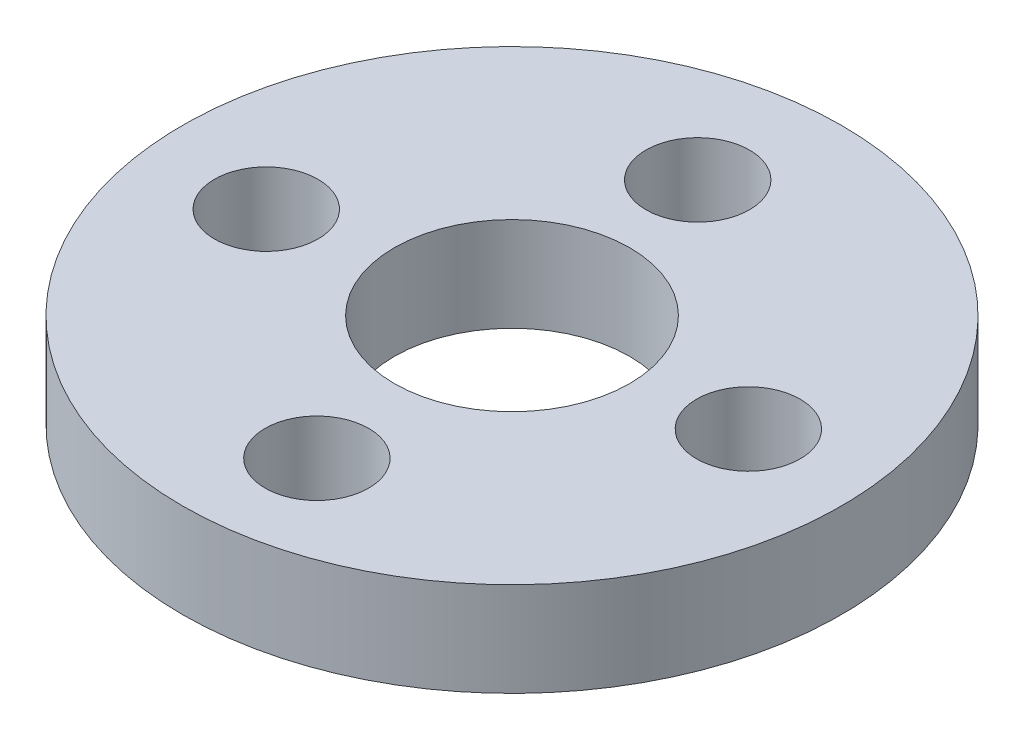
ISO-10303-21;
HEADER;
FILE_DESCRIPTION(('STEP AP214'),'2;1');
FILE_NAME('part.step','',(''),(''),'','','');
FILE_SCHEMA(('AUTOMOTIVE_DESIGN { 1 0 10303 214 1 1 1 1 }'));
ENDSEC;
DATA;
#1=APPLICATION_CONTEXT('core data for automotive mechanical design processes');
#2=APPLICATION_PROTOCOL_DEFINITION('international standard','automotive_design',2000,#1);
#3=PRODUCT_CONTEXT('',#1,'mechanical');
#4=PRODUCT('Part','Part','',(#3));
#5=PRODUCT_RELATED_PRODUCT_CATEGORY('part','',(#4));
#6=PRODUCT_DEFINITION_FORMATION('','',#4);
#7=PRODUCT_DEFINITION_CONTEXT('part definition',#1,'design');
#8=PRODUCT_DEFINITION('design','',#6,#7);
#9=PRODUCT_DEFINITION_SHAPE('','',#8);
#10=(LENGTH_UNIT() NAMED_UNIT(*) SI_UNIT(.MILLI.,.METRE.));
#11=(NAMED_UNIT(*) PLANE_ANGLE_UNIT() SI_UNIT($,.RADIAN.));
#12=(NAMED_UNIT(*) SI_UNIT($,.STERADIAN.) SOLID_ANGLE_UNIT());
#13=UNCERTAINTY_MEASURE_WITH_UNIT(LENGTH_MEASURE(1.E-05),#10,'distance_accuracy_value','');
#14=(GEOMETRIC_REPRESENTATION_CONTEXT(3) GLOBAL_UNCERTAINTY_ASSIGNED_CONTEXT((#13)) GLOBAL_UNIT_ASSIGNED_CONTEXT((#10,
#11,#12)) REPRESENTATION_CONTEXT('',''));
#15=CARTESIAN_POINT('',(0.,0.,0.));
#16=DIRECTION('',(0.,0.,1.));
#17=DIRECTION('',(1.,0.,0.));
#18=AXIS2_PLACEMENT_3D('',#15,#16,#17);
#19=CARTESIAN_POINT('',(0.,2.,0.));
#20=DIRECTION('',(0.,1.,0.));
#21=DIRECTION('',(0.,0.,1.));
#22=AXIS2_PLACEMENT_3D('',#19,#20,#21);
#23=PLANE('',#22);
#24=CARTESIAN_POINT('',(0.,2.,0.));
#25=DIRECTION('',(0.,1.,0.));
#26=DIRECTION('',(0.,0.,1.));
#27=AXIS2_PLACEMENT_3D('',#24,#25,#26);
#28=CIRCLE('',#27,2.5);
#29=CARTESIAN_POINT('',(0.,2.,2.5));
#30=VERTEX_POINT('',#29);
#31=EDGE_CURVE('E69',#30,#30,#28,.T.);
#32=ORIENTED_EDGE('',*,*,#31,.F.);
#33=EDGE_LOOP('',(#32));
#34=FACE_BOUND('',#33,.T.);
#35=CARTESIAN_POINT('',(0.551250558269466,2.,4.69562518740092));
#36=DIRECTION('',(0.,-1.,0.));
#37=DIRECTION('',(-0.231601331690098,0.,-0.972810784869994));
#38=AXIS2_PLACEMENT_3D('',#35,#36,#37);
#39=CIRCLE('',#38,1.1);
#40=CARTESIAN_POINT('',(0.296489093410358,2.,3.62553332404393));
#41=VERTEX_POINT('',#40);
#42=EDGE_CURVE('E51',#41,#41,#39,.T.);
#43=ORIENTED_EDGE('',*,*,#42,.T.);
#44=EDGE_LOOP('',(#43));
#45=FACE_BOUND('',#44,.T.);
#46=CARTESIAN_POINT('',(-0.524681620786664,2.,-4.46930746277415));
#47=DIRECTION('',(0.,1.,0.));
#48=DIRECTION('',(0.,0.,1.));
#49=AXIS2_PLACEMENT_3D('',#46,#47,#48);
#50=CIRCLE('',#49,1.1);
#51=CARTESIAN_POINT('',(-0.524681620786664,2.,-3.36930746277415));
#52=VERTEX_POINT('',#51);
#53=EDGE_CURVE('E45',#52,#52,#50,.T.);
#54=ORIENTED_EDGE('',*,*,#53,.F.);
#55=EDGE_LOOP('',(#54));
#56=FACE_BOUND('',#55,.T.);
#57=CARTESIAN_POINT('',(0.,2.,0.));
#58=DIRECTION('',(0.,1.,0.));
#59=DIRECTION('',(0.,0.,1.));
#60=AXIS2_PLACEMENT_3D('',#57,#58,#59);
#61=CIRCLE('',#60,7.);
#62=CARTESIAN_POINT('',(0.,2.,7.));
#63=VERTEX_POINT('',#62);
#64=EDGE_CURVE('E10',#63,#63,#61,.T.);
#65=ORIENTED_EDGE('',*,*,#64,.T.);
#66=EDGE_LOOP('',(#65));
#67=FACE_BOUND('',#66,.T.);
#68=CARTESIAN_POINT('',(4.59575079382894,2.,-0.424807227214669));
#69=DIRECTION('',(0.,1.,0.));
#70=DIRECTION('',(-1.,0.,0.));
#71=AXIS2_PLACEMENT_3D('',#68,#69,#70);
#72=CIRCLE('',#71,1.1);
#73=CARTESIAN_POINT('',(3.49575079382894,2.,-0.424807227214672));
#74=VERTEX_POINT('',#73);
#75=EDGE_CURVE('E57',#74,#74,#72,.T.);
#76=ORIENTED_EDGE('',*,*,#75,.F.);
#77=EDGE_LOOP('',(#76));
#78=FACE_BOUND('',#77,.T.);
#79=CARTESIAN_POINT('',(-4.56918185634613,2.,0.65112495184143));
#80=DIRECTION('',(0.,-1.,0.));
#81=DIRECTION('',(0.972810784869994,0.,-0.231601331690095));
#82=AXIS2_PLACEMENT_3D('',#79,#80,#81);
#83=CIRCLE('',#82,1.1);
#84=CARTESIAN_POINT('',(-3.49908999298914,2.,0.396363486982326));
#85=VERTEX_POINT('',#84);
#86=EDGE_CURVE('E63',#85,#85,#83,.T.);
#87=ORIENTED_EDGE('',*,*,#86,.T.);
#88=EDGE_LOOP('',(#87));
#89=FACE_BOUND('',#88,.T.);
#90=ADVANCED_FACE('F32',(#34,#45,#56,#67,#78,#89),#23,.T.);
#91=CARTESIAN_POINT('',(0.,0.,0.));
#92=DIRECTION('',(0.,1.,0.));
#93=DIRECTION('',(0.,0.,1.));
#94=AXIS2_PLACEMENT_3D('',#91,#92,#93);
#95=PLANE('',#94);
#96=CARTESIAN_POINT('',(0.,0.,0.));
#97=DIRECTION('',(0.,1.,0.));
#98=DIRECTION('',(0.,0.,1.));
#99=AXIS2_PLACEMENT_3D('',#96,#97,#98);
#100=CIRCLE('',#99,2.5);
#101=CARTESIAN_POINT('',(0.,0.,2.5));
#102=VERTEX_POINT('',#101);
#103=EDGE_CURVE('E66',#102,#102,#100,.T.);
#104=ORIENTED_EDGE('',*,*,#103,.T.);
#105=EDGE_LOOP('',(#104));
#106=FACE_BOUND('',#105,.T.);
#107=CARTESIAN_POINT('',(0.551250558269466,0.,4.69562518740092));
#108=DIRECTION('',(0.,-1.,0.));
#109=DIRECTION('',(-0.231601331690098,0.,-0.972810784869994));
#110=AXIS2_PLACEMENT_3D('',#107,#108,#109);
#111=CIRCLE('',#110,1.1);
#112=CARTESIAN_POINT('',(0.296489093410358,0.,3.62553332404393));
#113=VERTEX_POINT('',#112);
#114=EDGE_CURVE('E48',#113,#113,#111,.T.);
#115=ORIENTED_EDGE('',*,*,#114,.F.);
#116=EDGE_LOOP('',(#115));
#117=FACE_BOUND('',#116,.T.);
#118=CARTESIAN_POINT('',(-0.524681620786664,0.,-4.46930746277415));
#119=DIRECTION('',(0.,1.,0.));
#120=DIRECTION('',(0.,0.,1.));
#121=AXIS2_PLACEMENT_3D('',#118,#119,#120);
#122=CIRCLE('',#121,1.1);
#123=CARTESIAN_POINT('',(-0.524681620786664,0.,-3.36930746277415));
#124=VERTEX_POINT('',#123);
#125=EDGE_CURVE('E43',#124,#124,#122,.T.);
#126=ORIENTED_EDGE('',*,*,#125,.T.);
#127=EDGE_LOOP('',(#126));
#128=FACE_BOUND('',#127,.T.);
#129=CARTESIAN_POINT('',(0.,0.,0.));
#130=DIRECTION('',(0.,1.,0.));
#131=DIRECTION('',(0.,0.,1.));
#132=AXIS2_PLACEMENT_3D('',#129,#130,#131);
#133=CIRCLE('',#132,7.);
#134=CARTESIAN_POINT('',(0.,0.,7.));
#135=VERTEX_POINT('',#134);
#136=EDGE_CURVE('E36',#135,#135,#133,.T.);
#137=ORIENTED_EDGE('',*,*,#136,.F.);
#138=EDGE_LOOP('',(#137));
#139=FACE_BOUND('',#138,.T.);
#140=CARTESIAN_POINT('',(4.59575079382894,0.,-0.424807227214669));
#141=DIRECTION('',(0.,1.,0.));
#142=DIRECTION('',(-1.,0.,0.));
#143=AXIS2_PLACEMENT_3D('',#140,#141,#142);
#144=CIRCLE('',#143,1.1);
#145=CARTESIAN_POINT('',(3.49575079382894,0.,-0.424807227214672));
#146=VERTEX_POINT('',#145);
#147=EDGE_CURVE('E54',#146,#146,#144,.T.);
#148=ORIENTED_EDGE('',*,*,#147,.T.);
#149=EDGE_LOOP('',(#148));
#150=FACE_BOUND('',#149,.T.);
#151=CARTESIAN_POINT('',(-4.56918185634613,0.,0.65112495184143));
#152=DIRECTION('',(0.,-1.,0.));
#153=DIRECTION('',(0.972810784869994,0.,-0.231601331690095));
#154=AXIS2_PLACEMENT_3D('',#151,#152,#153);
#155=CIRCLE('',#154,1.1);
#156=CARTESIAN_POINT('',(-3.49908999298914,0.,0.396363486982326));
#157=VERTEX_POINT('',#156);
#158=EDGE_CURVE('E60',#157,#157,#155,.T.);
#159=ORIENTED_EDGE('',*,*,#158,.F.);
#160=EDGE_LOOP('',(#159));
#161=FACE_BOUND('',#160,.T.);
#162=ADVANCED_FACE('F75',(#106,#117,#128,#139,#150,#161),#95,.F.);
#163=CARTESIAN_POINT('',(0.,2.,0.));
#164=DIRECTION('',(0.,-1.,0.));
#165=DIRECTION('',(0.,0.,-1.));
#166=AXIS2_PLACEMENT_3D('',#163,#164,#165);
#167=CYLINDRICAL_SURFACE('',#166,7.);
#168=ORIENTED_EDGE('',*,*,#64,.F.);
#169=EDGE_LOOP('',(#168));
#170=FACE_BOUND('',#169,.T.);
#171=ORIENTED_EDGE('',*,*,#136,.T.);
#172=EDGE_LOOP('',(#171));
#173=FACE_BOUND('',#172,.T.);
#174=ADVANCED_FACE('F34',(#170,#173),#167,.T.);
#175=CARTESIAN_POINT('',(-0.524681620786664,0.,-4.46930746277415));
#176=DIRECTION('',(0.,1.,0.));
#177=DIRECTION('',(0.,0.,1.));
#178=AXIS2_PLACEMENT_3D('',#175,#176,#177);
#179=CYLINDRICAL_SURFACE('',#178,1.1);
#180=ORIENTED_EDGE('',*,*,#125,.F.);
#181=EDGE_LOOP('',(#180));
#182=FACE_BOUND('',#181,.T.);
#183=ORIENTED_EDGE('',*,*,#53,.T.);
#184=EDGE_LOOP('',(#183));
#185=FACE_BOUND('',#184,.T.);
#186=ADVANCED_FACE('F109',(#182,#185),#179,.F.);
#187=CARTESIAN_POINT('',(0.551250558269466,0.,4.69562518740092));
#188=DIRECTION('',(0.,1.,0.));
#189=DIRECTION('',(0.,0.,1.));
#190=AXIS2_PLACEMENT_3D('',#187,#188,#189);
#191=CYLINDRICAL_SURFACE('',#190,1.1);
#192=ORIENTED_EDGE('',*,*,#114,.T.);
#193=EDGE_LOOP('',(#192));
#194=FACE_BOUND('',#193,.T.);
#195=ORIENTED_EDGE('',*,*,#42,.F.);
#196=EDGE_LOOP('',(#195));
#197=FACE_BOUND('',#196,.T.);
#198=ADVANCED_FACE('F103',(#194,#197),#191,.F.);
#199=CARTESIAN_POINT('',(4.59575079382894,0.,-0.424807227214669));
#200=DIRECTION('',(0.,1.,0.));
#201=DIRECTION('',(0.,0.,1.));
#202=AXIS2_PLACEMENT_3D('',#199,#200,#201);
#203=CYLINDRICAL_SURFACE('',#202,1.1);
#204=ORIENTED_EDGE('',*,*,#147,.F.);
#205=EDGE_LOOP('',(#204));
#206=FACE_BOUND('',#205,.T.);
#207=ORIENTED_EDGE('',*,*,#75,.T.);
#208=EDGE_LOOP('',(#207));
#209=FACE_BOUND('',#208,.T.);
#210=ADVANCED_FACE('F97',(#206,#209),#203,.F.);
#211=CARTESIAN_POINT('',(-4.56918185634613,0.,0.65112495184143));
#212=DIRECTION('',(0.,1.,0.));
#213=DIRECTION('',(0.,0.,1.));
#214=AXIS2_PLACEMENT_3D('',#211,#212,#213);
#215=CYLINDRICAL_SURFACE('',#214,1.1);
#216=ORIENTED_EDGE('',*,*,#158,.T.);
#217=EDGE_LOOP('',(#216));
#218=FACE_BOUND('',#217,.T.);
#219=ORIENTED_EDGE('',*,*,#86,.F.);
#220=EDGE_LOOP('',(#219));
#221=FACE_BOUND('',#220,.T.);
#222=ADVANCED_FACE('F81',(#218,#221),#215,.F.);
#223=CARTESIAN_POINT('',(0.,0.,0.));
#224=DIRECTION('',(0.,1.,0.));
#225=DIRECTION('',(0.,0.,1.));
#226=AXIS2_PLACEMENT_3D('',#223,#224,#225);
#227=CYLINDRICAL_SURFACE('',#226,2.5);
#228=ORIENTED_EDGE('',*,*,#103,.F.);
#229=EDGE_LOOP('',(#228));
#230=FACE_BOUND('',#229,.T.);
#231=ORIENTED_EDGE('',*,*,#31,.T.);
#232=EDGE_LOOP('',(#231));
#233=FACE_BOUND('',#232,.T.);
#234=ADVANCED_FACE('F78',(#230,#233),#227,.F.);
#235=CLOSED_SHELL('',(#90,#162,#174,#186,#198,#210,#222,#234));
#236=MANIFOLD_SOLID_BREP('B2',#235);
#237=ADVANCED_BREP_SHAPE_REPRESENTATION('',(#18,#236),#14);
#238=SHAPE_DEFINITION_REPRESENTATION(#9,#237);
ENDSEC;
END-ISO-10303-21;
